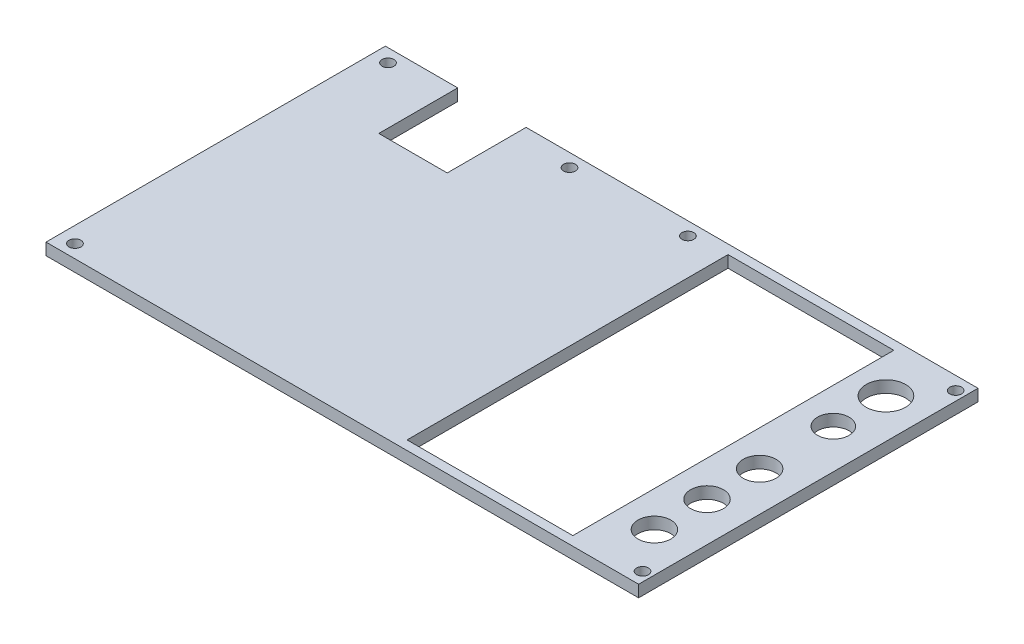
ISO-10303-21;
HEADER;
FILE_DESCRIPTION(('STEP AP214'),'2;1');
FILE_NAME('part.step','',(''),(''),'','','');
FILE_SCHEMA(('AUTOMOTIVE_DESIGN { 1 0 10303 214 1 1 1 1 }'));
ENDSEC;
DATA;
#1=APPLICATION_CONTEXT('core data for automotive mechanical design processes');
#2=APPLICATION_PROTOCOL_DEFINITION('international standard','automotive_design',2000,#1);
#3=PRODUCT_CONTEXT('',#1,'mechanical');
#4=PRODUCT('Part','Part','',(#3));
#5=PRODUCT_RELATED_PRODUCT_CATEGORY('part','',(#4));
#6=PRODUCT_DEFINITION_FORMATION('','',#4);
#7=PRODUCT_DEFINITION_CONTEXT('part definition',#1,'design');
#8=PRODUCT_DEFINITION('design','',#6,#7);
#9=PRODUCT_DEFINITION_SHAPE('','',#8);
#10=(LENGTH_UNIT() NAMED_UNIT(*) SI_UNIT(.MILLI.,.METRE.));
#11=(NAMED_UNIT(*) PLANE_ANGLE_UNIT() SI_UNIT($,.RADIAN.));
#12=(NAMED_UNIT(*) SI_UNIT($,.STERADIAN.) SOLID_ANGLE_UNIT());
#13=UNCERTAINTY_MEASURE_WITH_UNIT(LENGTH_MEASURE(1.E-05),#10,'distance_accuracy_value','');
#14=(GEOMETRIC_REPRESENTATION_CONTEXT(3) GLOBAL_UNCERTAINTY_ASSIGNED_CONTEXT((#13)) GLOBAL_UNIT_ASSIGNED_CONTEXT((#10,
#11,#12)) REPRESENTATION_CONTEXT('',''));
#15=CARTESIAN_POINT('',(0.,0.,0.));
#16=DIRECTION('',(0.,0.,1.));
#17=DIRECTION('',(1.,0.,0.));
#18=AXIS2_PLACEMENT_3D('',#15,#16,#17);
#19=CARTESIAN_POINT('',(0.,2.25,0.));
#20=DIRECTION('',(0.,-1.,0.));
#21=DIRECTION('',(0.,0.,-1.));
#22=AXIS2_PLACEMENT_3D('',#19,#20,#21);
#23=PLANE('',#22);
#24=CARTESIAN_POINT('',(-106.62,2.25,59.5));
#25=DIRECTION('',(0.,1.,0.));
#26=DIRECTION('',(0.,0.,1.));
#27=AXIS2_PLACEMENT_3D('',#24,#25,#26);
#28=CIRCLE('',#27,2.25);
#29=CARTESIAN_POINT('',(-106.62,2.25,61.75));
#30=VERTEX_POINT('',#29);
#31=EDGE_CURVE('E280',#30,#30,#28,.T.);
#32=ORIENTED_EDGE('',*,*,#31,.F.);
#33=EDGE_LOOP('',(#32));
#34=FACE_BOUND('',#33,.T.);
#35=CARTESIAN_POINT('',(-106.62,2.25,-59.5));
#36=DIRECTION('',(0.,1.,0.));
#37=DIRECTION('',(0.,0.,1.));
#38=AXIS2_PLACEMENT_3D('',#35,#36,#37);
#39=CIRCLE('',#38,2.25);
#40=CARTESIAN_POINT('',(-106.62,2.25,-57.25));
#41=VERTEX_POINT('',#40);
#42=EDGE_CURVE('E270',#41,#41,#39,.T.);
#43=ORIENTED_EDGE('',*,*,#42,.F.);
#44=EDGE_LOOP('',(#43));
#45=FACE_BOUND('',#44,.T.);
#46=CARTESIAN_POINT('',(-37.64,2.25,-59.5));
#47=DIRECTION('',(0.,1.,0.));
#48=DIRECTION('',(0.,0.,1.));
#49=AXIS2_PLACEMENT_3D('',#46,#47,#48);
#50=CIRCLE('',#49,2.25);
#51=CARTESIAN_POINT('',(-37.64,2.25,-57.25));
#52=VERTEX_POINT('',#51);
#53=EDGE_CURVE('E267',#52,#52,#50,.T.);
#54=ORIENTED_EDGE('',*,*,#53,.F.);
#55=EDGE_LOOP('',(#54));
#56=FACE_BOUND('',#55,.T.);
#57=CARTESIAN_POINT('',(7.35999999999997,2.25,-59.5));
#58=DIRECTION('',(0.,1.,0.));
#59=DIRECTION('',(0.,0.,1.));
#60=AXIS2_PLACEMENT_3D('',#57,#58,#59);
#61=CIRCLE('',#60,2.25);
#62=CARTESIAN_POINT('',(7.35999999999997,2.25,-57.25));
#63=VERTEX_POINT('',#62);
#64=EDGE_CURVE('E264',#63,#63,#61,.T.);
#65=ORIENTED_EDGE('',*,*,#64,.F.);
#66=EDGE_LOOP('',(#65));
#67=FACE_BOUND('',#66,.T.);
#68=CARTESIAN_POINT('',(109.12,2.25,-59.5));
#69=DIRECTION('',(0.,1.,0.));
#70=DIRECTION('',(0.,0.,1.));
#71=AXIS2_PLACEMENT_3D('',#68,#69,#70);
#72=CIRCLE('',#71,2.25);
#73=CARTESIAN_POINT('',(109.12,2.25,-57.25));
#74=VERTEX_POINT('',#73);
#75=EDGE_CURVE('E260',#74,#74,#72,.T.);
#76=ORIENTED_EDGE('',*,*,#75,.F.);
#77=EDGE_LOOP('',(#76));
#78=FACE_BOUND('',#77,.T.);
#79=CARTESIAN_POINT('',(97.62,2.25,43.5));
#80=DIRECTION('',(0.,1.,0.));
#81=DIRECTION('',(0.,0.,1.));
#82=AXIS2_PLACEMENT_3D('',#79,#80,#81);
#83=CIRCLE('',#82,6.25);
#84=CARTESIAN_POINT('',(97.62,2.25,49.75));
#85=VERTEX_POINT('',#84);
#86=EDGE_CURVE('E171',#85,#85,#83,.T.);
#87=ORIENTED_EDGE('',*,*,#86,.F.);
#88=EDGE_LOOP('',(#87));
#89=FACE_BOUND('',#88,.T.);
#90=CARTESIAN_POINT('',(97.62,2.25,23.5));
#91=DIRECTION('',(0.,1.,0.));
#92=DIRECTION('',(0.,0.,1.));
#93=AXIS2_PLACEMENT_3D('',#90,#91,#92);
#94=CIRCLE('',#93,6.25);
#95=CARTESIAN_POINT('',(97.62,2.25,29.75));
#96=VERTEX_POINT('',#95);
#97=EDGE_CURVE('E177',#96,#96,#94,.T.);
#98=ORIENTED_EDGE('',*,*,#97,.F.);
#99=EDGE_LOOP('',(#98));
#100=FACE_BOUND('',#99,.T.);
#101=CARTESIAN_POINT('',(97.62,2.25,3.5));
#102=DIRECTION('',(0.,1.,0.));
#103=DIRECTION('',(0.,0.,1.));
#104=AXIS2_PLACEMENT_3D('',#101,#102,#103);
#105=CIRCLE('',#104,6.25);
#106=CARTESIAN_POINT('',(97.62,2.25,9.75));
#107=VERTEX_POINT('',#106);
#108=EDGE_CURVE('E183',#107,#107,#105,.T.);
#109=ORIENTED_EDGE('',*,*,#108,.F.);
#110=EDGE_LOOP('',(#109));
#111=FACE_BOUND('',#110,.T.);
#112=CARTESIAN_POINT('',(97.62,2.25,-24.5));
#113=DIRECTION('',(0.,1.,0.));
#114=DIRECTION('',(0.,0.,1.));
#115=AXIS2_PLACEMENT_3D('',#112,#113,#114);
#116=CIRCLE('',#115,6.);
#117=CARTESIAN_POINT('',(97.62,2.25,-18.5));
#118=VERTEX_POINT('',#117);
#119=EDGE_CURVE('E189',#118,#118,#116,.T.);
#120=ORIENTED_EDGE('',*,*,#119,.F.);
#121=EDGE_LOOP('',(#120));
#122=FACE_BOUND('',#121,.T.);
#123=CARTESIAN_POINT('',(97.62,2.25,-44.5));
#124=DIRECTION('',(0.,1.,0.));
#125=DIRECTION('',(0.,0.,1.));
#126=AXIS2_PLACEMENT_3D('',#123,#124,#125);
#127=CIRCLE('',#126,7.5);
#128=CARTESIAN_POINT('',(97.62,2.25,-37.));
#129=VERTEX_POINT('',#128);
#130=EDGE_CURVE('E163',#129,#129,#127,.T.);
#131=ORIENTED_EDGE('',*,*,#130,.F.);
#132=EDGE_LOOP('',(#131));
#133=FACE_BOUND('',#132,.T.);
#134=DIRECTION('',(1.,0.,0.));
#135=VECTOR('',#134,1.);
#136=CARTESIAN_POINT('',(21.12,2.25,61.));
#137=LINE('',#136,#135);
#138=CARTESIAN_POINT('',(21.12,2.25,61.));
#139=VERTEX_POINT('',#138);
#140=CARTESIAN_POINT('',(84.12,2.25,61.));
#141=VERTEX_POINT('',#140);
#142=EDGE_CURVE('E212',#139,#141,#137,.T.);
#143=ORIENTED_EDGE('',*,*,#142,.F.);
#144=DIRECTION('',(0.,0.,1.));
#145=VECTOR('',#144,1.);
#146=CARTESIAN_POINT('',(21.12,2.25,61.));
#147=LINE('',#146,#145);
#148=CARTESIAN_POINT('',(21.1199999999999,2.25,-61.));
#149=VERTEX_POINT('',#148);
#150=EDGE_CURVE('E62',#149,#139,#147,.T.);
#151=ORIENTED_EDGE('',*,*,#150,.F.);
#152=DIRECTION('',(-1.,0.,0.));
#153=VECTOR('',#152,1.);
#154=CARTESIAN_POINT('',(21.1199999999999,2.25,-61.));
#155=LINE('',#154,#153);
#156=CARTESIAN_POINT('',(84.12,2.25,-61.));
#157=VERTEX_POINT('',#156);
#158=EDGE_CURVE('E201',#157,#149,#155,.T.);
#159=ORIENTED_EDGE('',*,*,#158,.F.);
#160=DIRECTION('',(0.,0.,-1.));
#161=VECTOR('',#160,1.);
#162=CARTESIAN_POINT('',(84.12,2.25,61.));
#163=LINE('',#162,#161);
#164=EDGE_CURVE('E215',#141,#157,#163,.T.);
#165=ORIENTED_EDGE('',*,*,#164,.F.);
#166=EDGE_LOOP('',(#143,#151,#159,#165));
#167=FACE_BOUND('',#166,.T.);
#168=DIRECTION('',(1.,0.,0.));
#169=VECTOR('',#168,1.);
#170=CARTESIAN_POINT('',(-85.13,2.25,-34.5));
#171=LINE('',#170,#169);
#172=CARTESIAN_POINT('',(-85.13,2.25,-34.5));
#173=VERTEX_POINT('',#172);
#174=CARTESIAN_POINT('',(-59.13,2.25,-34.5));
#175=VERTEX_POINT('',#174);
#176=EDGE_CURVE('E152',#173,#175,#171,.T.);
#177=ORIENTED_EDGE('',*,*,#176,.F.);
#178=DIRECTION('',(0.,0.,1.));
#179=VECTOR('',#178,1.);
#180=CARTESIAN_POINT('',(-85.13,2.25,-64.5));
#181=LINE('',#180,#179);
#182=CARTESIAN_POINT('',(-85.13,2.25,-64.5));
#183=VERTEX_POINT('',#182);
#184=EDGE_CURVE('E134',#183,#173,#181,.T.);
#185=ORIENTED_EDGE('',*,*,#184,.F.);
#186=DIRECTION('',(-1.,0.,0.));
#187=VECTOR('',#186,1.);
#188=CARTESIAN_POINT('',(-112.62,2.25,-64.5));
#189=LINE('',#188,#187);
#190=CARTESIAN_POINT('',(-112.62,2.25,-64.5));
#191=VERTEX_POINT('',#190);
#192=EDGE_CURVE('E236',#183,#191,#189,.T.);
#193=ORIENTED_EDGE('',*,*,#192,.T.);
#194=DIRECTION('',(0.,0.,1.));
#195=VECTOR('',#194,1.);
#196=CARTESIAN_POINT('',(-112.62,2.25,64.5));
#197=LINE('',#196,#195);
#198=CARTESIAN_POINT('',(-112.62,2.25,64.5));
#199=VERTEX_POINT('',#198);
#200=EDGE_CURVE('E228',#191,#199,#197,.T.);
#201=ORIENTED_EDGE('',*,*,#200,.T.);
#202=DIRECTION('',(1.,0.,0.));
#203=VECTOR('',#202,1.);
#204=CARTESIAN_POINT('',(-112.62,2.25,64.5));
#205=LINE('',#204,#203);
#206=CARTESIAN_POINT('',(112.62,2.25,64.5));
#207=VERTEX_POINT('',#206);
#208=EDGE_CURVE('E231',#199,#207,#205,.T.);
#209=ORIENTED_EDGE('',*,*,#208,.T.);
#210=DIRECTION('',(0.,0.,-1.));
#211=VECTOR('',#210,1.);
#212=CARTESIAN_POINT('',(112.62,2.25,64.5));
#213=LINE('',#212,#211);
#214=CARTESIAN_POINT('',(112.62,2.25,-64.5));
#215=VERTEX_POINT('',#214);
#216=EDGE_CURVE('E234',#207,#215,#213,.T.);
#217=ORIENTED_EDGE('',*,*,#216,.T.);
#218=CARTESIAN_POINT('',(-59.13,2.25,-64.5));
#219=VERTEX_POINT('',#218);
#220=EDGE_CURVE('E237',#215,#219,#189,.T.);
#221=ORIENTED_EDGE('',*,*,#220,.T.);
#222=DIRECTION('',(0.,0.,-1.));
#223=VECTOR('',#222,1.);
#224=CARTESIAN_POINT('',(-59.13,2.25,-64.5));
#225=LINE('',#224,#223);
#226=EDGE_CURVE('E150',#175,#219,#225,.T.);
#227=ORIENTED_EDGE('',*,*,#226,.F.);
#228=EDGE_LOOP('',(#177,#185,#193,#201,#209,#217,#221,#227));
#229=FACE_BOUND('',#228,.T.);
#230=CARTESIAN_POINT('',(109.12,2.25,59.5));
#231=DIRECTION('',(0.,1.,0.));
#232=DIRECTION('',(0.,0.,1.));
#233=AXIS2_PLACEMENT_3D('',#230,#231,#232);
#234=CIRCLE('',#233,2.25);
#235=CARTESIAN_POINT('',(109.12,2.25,61.75));
#236=VERTEX_POINT('',#235);
#237=EDGE_CURVE('E259',#236,#236,#234,.T.);
#238=ORIENTED_EDGE('',*,*,#237,.F.);
#239=EDGE_LOOP('',(#238));
#240=FACE_BOUND('',#239,.T.);
#241=ADVANCED_FACE('F37',(#34,#45,#56,#67,#78,#89,#100,#111,#122,#133,#167,#229,#240),#23,.F.);
#242=CARTESIAN_POINT('',(-112.62,2.25,-64.5));
#243=DIRECTION('',(0.,0.,1.));
#244=DIRECTION('',(1.,0.,0.));
#245=AXIS2_PLACEMENT_3D('',#242,#243,#244);
#246=PLANE('',#245);
#247=ORIENTED_EDGE('',*,*,#192,.F.);
#248=DIRECTION('',(0.,1.,0.));
#249=VECTOR('',#248,1.);
#250=CARTESIAN_POINT('',(-85.13,-2.25,-64.5));
#251=LINE('',#250,#249);
#252=CARTESIAN_POINT('',(-85.13,-2.25,-64.5));
#253=VERTEX_POINT('',#252);
#254=EDGE_CURVE('E161',#253,#183,#251,.T.);
#255=ORIENTED_EDGE('',*,*,#254,.F.);
#256=DIRECTION('',(-1.,0.,0.));
#257=VECTOR('',#256,1.);
#258=CARTESIAN_POINT('',(-112.62,-2.25,-64.5));
#259=LINE('',#258,#257);
#260=CARTESIAN_POINT('',(-112.62,-2.25,-64.5));
#261=VERTEX_POINT('',#260);
#262=EDGE_CURVE('E149',#253,#261,#259,.T.);
#263=ORIENTED_EDGE('',*,*,#262,.T.);
#264=DIRECTION('',(0.,-1.,0.));
#265=VECTOR('',#264,1.);
#266=CARTESIAN_POINT('',(-112.62,2.25,-64.5));
#267=LINE('',#266,#265);
#268=EDGE_CURVE('E240',#191,#261,#267,.T.);
#269=ORIENTED_EDGE('',*,*,#268,.F.);
#270=EDGE_LOOP('',(#247,#255,#263,#269));
#271=FACE_BOUND('',#270,.T.);
#272=ADVANCED_FACE('F308',(#271),#246,.F.);
#273=CARTESIAN_POINT('',(-112.62,2.25,64.5));
#274=DIRECTION('',(1.,0.,0.));
#275=DIRECTION('',(0.,0.,-1.));
#276=AXIS2_PLACEMENT_3D('',#273,#274,#275);
#277=PLANE('',#276);
#278=DIRECTION('',(0.,0.,1.));
#279=VECTOR('',#278,1.);
#280=CARTESIAN_POINT('',(-112.62,-2.25,64.5));
#281=LINE('',#280,#279);
#282=CARTESIAN_POINT('',(-112.62,-2.25,64.5));
#283=VERTEX_POINT('',#282);
#284=EDGE_CURVE('E222',#261,#283,#281,.T.);
#285=ORIENTED_EDGE('',*,*,#284,.T.);
#286=DIRECTION('',(0.,-1.,0.));
#287=VECTOR('',#286,1.);
#288=CARTESIAN_POINT('',(-112.62,2.25,64.5));
#289=LINE('',#288,#287);
#290=EDGE_CURVE('E11',#199,#283,#289,.T.);
#291=ORIENTED_EDGE('',*,*,#290,.F.);
#292=ORIENTED_EDGE('',*,*,#200,.F.);
#293=ORIENTED_EDGE('',*,*,#268,.T.);
#294=EDGE_LOOP('',(#285,#291,#292,#293));
#295=FACE_BOUND('',#294,.T.);
#296=ADVANCED_FACE('F39',(#295),#277,.F.);
#297=CARTESIAN_POINT('',(-112.62,2.25,64.5));
#298=DIRECTION('',(0.,0.,-1.));
#299=DIRECTION('',(-1.,0.,0.));
#300=AXIS2_PLACEMENT_3D('',#297,#298,#299);
#301=PLANE('',#300);
#302=DIRECTION('',(1.,0.,0.));
#303=VECTOR('',#302,1.);
#304=CARTESIAN_POINT('',(-112.62,-2.25,64.5));
#305=LINE('',#304,#303);
#306=CARTESIAN_POINT('',(112.62,-2.25,64.5));
#307=VERTEX_POINT('',#306);
#308=EDGE_CURVE('E243',#283,#307,#305,.T.);
#309=ORIENTED_EDGE('',*,*,#308,.T.);
#310=DIRECTION('',(0.,-1.,0.));
#311=VECTOR('',#310,1.);
#312=CARTESIAN_POINT('',(112.62,2.25,64.5));
#313=LINE('',#312,#311);
#314=EDGE_CURVE('E46',#207,#307,#313,.T.);
#315=ORIENTED_EDGE('',*,*,#314,.F.);
#316=ORIENTED_EDGE('',*,*,#208,.F.);
#317=ORIENTED_EDGE('',*,*,#290,.T.);
#318=EDGE_LOOP('',(#309,#315,#316,#317));
#319=FACE_BOUND('',#318,.T.);
#320=ADVANCED_FACE('F463',(#319),#301,.F.);
#321=CARTESIAN_POINT('',(112.62,2.25,64.5));
#322=DIRECTION('',(-1.,0.,0.));
#323=DIRECTION('',(0.,0.,1.));
#324=AXIS2_PLACEMENT_3D('',#321,#322,#323);
#325=PLANE('',#324);
#326=DIRECTION('',(0.,0.,-1.));
#327=VECTOR('',#326,1.);
#328=CARTESIAN_POINT('',(112.62,-2.25,64.5));
#329=LINE('',#328,#327);
#330=CARTESIAN_POINT('',(112.62,-2.25,-64.5));
#331=VERTEX_POINT('',#330);
#332=EDGE_CURVE('E245',#307,#331,#329,.T.);
#333=ORIENTED_EDGE('',*,*,#332,.T.);
#334=DIRECTION('',(0.,-1.,0.));
#335=VECTOR('',#334,1.);
#336=CARTESIAN_POINT('',(112.62,2.25,-64.5));
#337=LINE('',#336,#335);
#338=EDGE_CURVE('E251',#215,#331,#337,.T.);
#339=ORIENTED_EDGE('',*,*,#338,.F.);
#340=ORIENTED_EDGE('',*,*,#216,.F.);
#341=ORIENTED_EDGE('',*,*,#314,.T.);
#342=EDGE_LOOP('',(#333,#339,#340,#341));
#343=FACE_BOUND('',#342,.T.);
#344=ADVANCED_FACE('F305',(#343),#325,.F.);
#345=CARTESIAN_POINT('',(-59.13,-2.25,-64.5));
#346=VERTEX_POINT('',#345);
#347=EDGE_CURVE('E232',#331,#346,#259,.T.);
#348=ORIENTED_EDGE('',*,*,#347,.T.);
#349=DIRECTION('',(0.,1.,0.));
#350=VECTOR('',#349,1.);
#351=CARTESIAN_POINT('',(-59.13,-2.25,-64.5));
#352=LINE('',#351,#350);
#353=EDGE_CURVE('E164',#346,#219,#352,.T.);
#354=ORIENTED_EDGE('',*,*,#353,.T.);
#355=ORIENTED_EDGE('',*,*,#220,.F.);
#356=ORIENTED_EDGE('',*,*,#338,.T.);
#357=EDGE_LOOP('',(#348,#354,#355,#356));
#358=FACE_BOUND('',#357,.T.);
#359=ADVANCED_FACE('F296',(#358),#246,.F.);
#360=CARTESIAN_POINT('',(0.,-2.25,0.));
#361=DIRECTION('',(0.,-1.,0.));
#362=DIRECTION('',(0.,0.,-1.));
#363=AXIS2_PLACEMENT_3D('',#360,#361,#362);
#364=PLANE('',#363);
#365=CARTESIAN_POINT('',(-106.62,-2.25,59.5));
#366=DIRECTION('',(0.,-1.,0.));
#367=DIRECTION('',(0.,0.,-1.));
#368=AXIS2_PLACEMENT_3D('',#365,#366,#367);
#369=CIRCLE('',#368,2.25);
#370=CARTESIAN_POINT('',(-106.62,-2.25,57.25));
#371=VERTEX_POINT('',#370);
#372=EDGE_CURVE('E41',#371,#371,#369,.T.);
#373=ORIENTED_EDGE('',*,*,#372,.F.);
#374=EDGE_LOOP('',(#373));
#375=FACE_BOUND('',#374,.T.);
#376=CARTESIAN_POINT('',(-106.62,-2.25,-59.5));
#377=DIRECTION('',(0.,-1.,0.));
#378=DIRECTION('',(0.,0.,-1.));
#379=AXIS2_PLACEMENT_3D('',#376,#377,#378);
#380=CIRCLE('',#379,2.25);
#381=CARTESIAN_POINT('',(-106.62,-2.25,-61.75));
#382=VERTEX_POINT('',#381);
#383=EDGE_CURVE('E268',#382,#382,#380,.T.);
#384=ORIENTED_EDGE('',*,*,#383,.F.);
#385=EDGE_LOOP('',(#384));
#386=FACE_BOUND('',#385,.T.);
#387=CARTESIAN_POINT('',(-37.64,-2.25,-59.5));
#388=DIRECTION('',(0.,-1.,0.));
#389=DIRECTION('',(0.,0.,-1.));
#390=AXIS2_PLACEMENT_3D('',#387,#388,#389);
#391=CIRCLE('',#390,2.25);
#392=CARTESIAN_POINT('',(-37.64,-2.25,-61.75));
#393=VERTEX_POINT('',#392);
#394=EDGE_CURVE('E265',#393,#393,#391,.T.);
#395=ORIENTED_EDGE('',*,*,#394,.F.);
#396=EDGE_LOOP('',(#395));
#397=FACE_BOUND('',#396,.T.);
#398=CARTESIAN_POINT('',(7.35999999999997,-2.25,-59.5));
#399=DIRECTION('',(0.,-1.,0.));
#400=DIRECTION('',(0.,0.,-1.));
#401=AXIS2_PLACEMENT_3D('',#398,#399,#400);
#402=CIRCLE('',#401,2.25);
#403=CARTESIAN_POINT('',(7.35999999999997,-2.25,-61.75));
#404=VERTEX_POINT('',#403);
#405=EDGE_CURVE('E261',#404,#404,#402,.T.);
#406=ORIENTED_EDGE('',*,*,#405,.F.);
#407=EDGE_LOOP('',(#406));
#408=FACE_BOUND('',#407,.T.);
#409=CARTESIAN_POINT('',(109.12,-2.25,-59.5));
#410=DIRECTION('',(0.,-1.,0.));
#411=DIRECTION('',(0.,0.,-1.));
#412=AXIS2_PLACEMENT_3D('',#409,#410,#411);
#413=CIRCLE('',#412,2.25);
#414=CARTESIAN_POINT('',(109.12,-2.25,-61.75));
#415=VERTEX_POINT('',#414);
#416=EDGE_CURVE('E256',#415,#415,#413,.T.);
#417=ORIENTED_EDGE('',*,*,#416,.F.);
#418=EDGE_LOOP('',(#417));
#419=FACE_BOUND('',#418,.T.);
#420=CARTESIAN_POINT('',(109.12,-2.25,59.5));
#421=DIRECTION('',(0.,-1.,0.));
#422=DIRECTION('',(0.,0.,-1.));
#423=AXIS2_PLACEMENT_3D('',#420,#421,#422);
#424=CIRCLE('',#423,2.25);
#425=CARTESIAN_POINT('',(109.12,-2.25,57.25));
#426=VERTEX_POINT('',#425);
#427=EDGE_CURVE('E155',#426,#426,#424,.T.);
#428=ORIENTED_EDGE('',*,*,#427,.F.);
#429=EDGE_LOOP('',(#428));
#430=FACE_BOUND('',#429,.T.);
#431=DIRECTION('',(0.,0.,1.));
#432=VECTOR('',#431,1.);
#433=CARTESIAN_POINT('',(-85.13,-2.25,-64.5));
#434=LINE('',#433,#432);
#435=CARTESIAN_POINT('',(-85.13,-2.25,-34.5));
#436=VERTEX_POINT('',#435);
#437=EDGE_CURVE('E131',#253,#436,#434,.T.);
#438=ORIENTED_EDGE('',*,*,#437,.T.);
#439=DIRECTION('',(1.,0.,0.));
#440=VECTOR('',#439,1.);
#441=CARTESIAN_POINT('',(-85.13,-2.25,-34.5));
#442=LINE('',#441,#440);
#443=CARTESIAN_POINT('',(-59.13,-2.25,-34.5));
#444=VERTEX_POINT('',#443);
#445=EDGE_CURVE('E141',#436,#444,#442,.T.);
#446=ORIENTED_EDGE('',*,*,#445,.T.);
#447=DIRECTION('',(0.,0.,-1.));
#448=VECTOR('',#447,1.);
#449=CARTESIAN_POINT('',(-59.13,-2.25,-64.5));
#450=LINE('',#449,#448);
#451=EDGE_CURVE('E54',#444,#346,#450,.T.);
#452=ORIENTED_EDGE('',*,*,#451,.T.);
#453=ORIENTED_EDGE('',*,*,#347,.F.);
#454=ORIENTED_EDGE('',*,*,#332,.F.);
#455=ORIENTED_EDGE('',*,*,#308,.F.);
#456=ORIENTED_EDGE('',*,*,#284,.F.);
#457=ORIENTED_EDGE('',*,*,#262,.F.);
#458=EDGE_LOOP('',(#438,#446,#452,#453,#454,#455,#456,#457));
#459=FACE_BOUND('',#458,.T.);
#460=CARTESIAN_POINT('',(97.62,-2.25,43.5));
#461=DIRECTION('',(0.,1.,0.));
#462=DIRECTION('',(0.,0.,1.));
#463=AXIS2_PLACEMENT_3D('',#460,#461,#462);
#464=CIRCLE('',#463,6.25);
#465=CARTESIAN_POINT('',(97.62,-2.25,49.75));
#466=VERTEX_POINT('',#465);
#467=EDGE_CURVE('E168',#466,#466,#464,.T.);
#468=ORIENTED_EDGE('',*,*,#467,.T.);
#469=EDGE_LOOP('',(#468));
#470=FACE_BOUND('',#469,.T.);
#471=CARTESIAN_POINT('',(97.62,-2.25,23.5));
#472=DIRECTION('',(0.,1.,0.));
#473=DIRECTION('',(0.,0.,1.));
#474=AXIS2_PLACEMENT_3D('',#471,#472,#473);
#475=CIRCLE('',#474,6.25);
#476=CARTESIAN_POINT('',(97.62,-2.25,29.75));
#477=VERTEX_POINT('',#476);
#478=EDGE_CURVE('E174',#477,#477,#475,.T.);
#479=ORIENTED_EDGE('',*,*,#478,.T.);
#480=EDGE_LOOP('',(#479));
#481=FACE_BOUND('',#480,.T.);
#482=CARTESIAN_POINT('',(97.62,-2.25,3.5));
#483=DIRECTION('',(0.,1.,0.));
#484=DIRECTION('',(0.,0.,1.));
#485=AXIS2_PLACEMENT_3D('',#482,#483,#484);
#486=CIRCLE('',#485,6.25);
#487=CARTESIAN_POINT('',(97.62,-2.25,9.75));
#488=VERTEX_POINT('',#487);
#489=EDGE_CURVE('E180',#488,#488,#486,.T.);
#490=ORIENTED_EDGE('',*,*,#489,.T.);
#491=EDGE_LOOP('',(#490));
#492=FACE_BOUND('',#491,.T.);
#493=CARTESIAN_POINT('',(97.62,-2.25,-24.5));
#494=DIRECTION('',(0.,1.,0.));
#495=DIRECTION('',(0.,0.,1.));
#496=AXIS2_PLACEMENT_3D('',#493,#494,#495);
#497=CIRCLE('',#496,6.);
#498=CARTESIAN_POINT('',(97.62,-2.25,-18.5));
#499=VERTEX_POINT('',#498);
#500=EDGE_CURVE('E186',#499,#499,#497,.T.);
#501=ORIENTED_EDGE('',*,*,#500,.T.);
#502=EDGE_LOOP('',(#501));
#503=FACE_BOUND('',#502,.T.);
#504=CARTESIAN_POINT('',(97.62,-2.25,-44.5));
#505=DIRECTION('',(0.,1.,0.));
#506=DIRECTION('',(0.,0.,1.));
#507=AXIS2_PLACEMENT_3D('',#504,#505,#506);
#508=CIRCLE('',#507,7.5);
#509=CARTESIAN_POINT('',(97.62,-2.25,-37.));
#510=VERTEX_POINT('',#509);
#511=EDGE_CURVE('E192',#510,#510,#508,.T.);
#512=ORIENTED_EDGE('',*,*,#511,.T.);
#513=EDGE_LOOP('',(#512));
#514=FACE_BOUND('',#513,.T.);
#515=DIRECTION('',(0.,0.,1.));
#516=VECTOR('',#515,1.);
#517=CARTESIAN_POINT('',(21.12,-2.25,61.));
#518=LINE('',#517,#516);
#519=CARTESIAN_POINT('',(21.1199999999999,-2.25,-61.));
#520=VERTEX_POINT('',#519);
#521=CARTESIAN_POINT('',(21.12,-2.25,61.));
#522=VERTEX_POINT('',#521);
#523=EDGE_CURVE('E197',#520,#522,#518,.T.);
#524=ORIENTED_EDGE('',*,*,#523,.T.);
#525=DIRECTION('',(1.,0.,0.));
#526=VECTOR('',#525,1.);
#527=CARTESIAN_POINT('',(21.12,-2.25,61.));
#528=LINE('',#527,#526);
#529=CARTESIAN_POINT('',(84.12,-2.25,61.));
#530=VERTEX_POINT('',#529);
#531=EDGE_CURVE('E200',#522,#530,#528,.T.);
#532=ORIENTED_EDGE('',*,*,#531,.T.);
#533=DIRECTION('',(0.,0.,-1.));
#534=VECTOR('',#533,1.);
#535=CARTESIAN_POINT('',(84.12,-2.25,61.));
#536=LINE('',#535,#534);
#537=CARTESIAN_POINT('',(84.12,-2.25,-61.));
#538=VERTEX_POINT('',#537);
#539=EDGE_CURVE('E204',#530,#538,#536,.T.);
#540=ORIENTED_EDGE('',*,*,#539,.T.);
#541=DIRECTION('',(-1.,0.,0.));
#542=VECTOR('',#541,1.);
#543=CARTESIAN_POINT('',(21.1199999999999,-2.25,-61.));
#544=LINE('',#543,#542);
#545=EDGE_CURVE('E207',#538,#520,#544,.T.);
#546=ORIENTED_EDGE('',*,*,#545,.T.);
#547=EDGE_LOOP('',(#524,#532,#540,#546));
#548=FACE_BOUND('',#547,.T.);
#549=ADVANCED_FACE('F146',(#375,#386,#397,#408,#419,#430,#459,#470,#481,#492,#503,#514,#548),
#364,.T.);
#550=CARTESIAN_POINT('',(21.12,-2.25,61.));
#551=DIRECTION('',(-1.,0.,0.));
#552=DIRECTION('',(0.,0.,1.));
#553=AXIS2_PLACEMENT_3D('',#550,#551,#552);
#554=PLANE('',#553);
#555=ORIENTED_EDGE('',*,*,#150,.T.);
#556=DIRECTION('',(0.,1.,0.));
#557=VECTOR('',#556,1.);
#558=CARTESIAN_POINT('',(21.12,-2.25,61.));
#559=LINE('',#558,#557);
#560=EDGE_CURVE('E210',#522,#139,#559,.T.);
#561=ORIENTED_EDGE('',*,*,#560,.F.);
#562=ORIENTED_EDGE('',*,*,#523,.F.);
#563=DIRECTION('',(0.,1.,0.));
#564=VECTOR('',#563,1.);
#565=CARTESIAN_POINT('',(21.1199999999999,-2.25,-61.));
#566=LINE('',#565,#564);
#567=EDGE_CURVE('E220',#520,#149,#566,.T.);
#568=ORIENTED_EDGE('',*,*,#567,.T.);
#569=EDGE_LOOP('',(#555,#561,#562,#568));
#570=FACE_BOUND('',#569,.T.);
#571=ADVANCED_FACE('F295',(#570),#554,.F.);
#572=CARTESIAN_POINT('',(21.1199999999999,-2.25,-61.));
#573=DIRECTION('',(0.,0.,-1.));
#574=DIRECTION('',(-1.,0.,0.));
#575=AXIS2_PLACEMENT_3D('',#572,#573,#574);
#576=PLANE('',#575);
#577=ORIENTED_EDGE('',*,*,#158,.T.);
#578=ORIENTED_EDGE('',*,*,#567,.F.);
#579=ORIENTED_EDGE('',*,*,#545,.F.);
#580=DIRECTION('',(0.,1.,0.));
#581=VECTOR('',#580,1.);
#582=CARTESIAN_POINT('',(84.12,-2.25,-61.));
#583=LINE('',#582,#581);
#584=EDGE_CURVE('E223',#538,#157,#583,.T.);
#585=ORIENTED_EDGE('',*,*,#584,.T.);
#586=EDGE_LOOP('',(#577,#578,#579,#585));
#587=FACE_BOUND('',#586,.T.);
#588=ADVANCED_FACE('F303',(#587),#576,.F.);
#589=CARTESIAN_POINT('',(84.12,-2.25,61.));
#590=DIRECTION('',(1.,0.,0.));
#591=DIRECTION('',(0.,0.,-1.));
#592=AXIS2_PLACEMENT_3D('',#589,#590,#591);
#593=PLANE('',#592);
#594=ORIENTED_EDGE('',*,*,#164,.T.);
#595=ORIENTED_EDGE('',*,*,#584,.F.);
#596=ORIENTED_EDGE('',*,*,#539,.F.);
#597=DIRECTION('',(0.,1.,0.));
#598=VECTOR('',#597,1.);
#599=CARTESIAN_POINT('',(84.12,-2.25,61.));
#600=LINE('',#599,#598);
#601=EDGE_CURVE('E225',#530,#141,#600,.T.);
#602=ORIENTED_EDGE('',*,*,#601,.T.);
#603=EDGE_LOOP('',(#594,#595,#596,#602));
#604=FACE_BOUND('',#603,.T.);
#605=ADVANCED_FACE('F325',(#604),#593,.F.);
#606=CARTESIAN_POINT('',(21.12,-2.25,61.));
#607=DIRECTION('',(0.,0.,1.));
#608=DIRECTION('',(1.,0.,0.));
#609=AXIS2_PLACEMENT_3D('',#606,#607,#608);
#610=PLANE('',#609);
#611=ORIENTED_EDGE('',*,*,#142,.T.);
#612=ORIENTED_EDGE('',*,*,#601,.F.);
#613=ORIENTED_EDGE('',*,*,#531,.F.);
#614=ORIENTED_EDGE('',*,*,#560,.T.);
#615=EDGE_LOOP('',(#611,#612,#613,#614));
#616=FACE_BOUND('',#615,.T.);
#617=ADVANCED_FACE('F321',(#616),#610,.F.);
#618=CARTESIAN_POINT('',(97.62,-2.25,-44.5));
#619=DIRECTION('',(0.,1.,0.));
#620=DIRECTION('',(0.,0.,1.));
#621=AXIS2_PLACEMENT_3D('',#618,#619,#620);
#622=CYLINDRICAL_SURFACE('',#621,7.5);
#623=ORIENTED_EDGE('',*,*,#511,.F.);
#624=EDGE_LOOP('',(#623));
#625=FACE_BOUND('',#624,.T.);
#626=ORIENTED_EDGE('',*,*,#130,.T.);
#627=EDGE_LOOP('',(#626));
#628=FACE_BOUND('',#627,.T.);
#629=ADVANCED_FACE('F324',(#625,#628),#622,.F.);
#630=CARTESIAN_POINT('',(97.62,-2.25,-24.5));
#631=DIRECTION('',(0.,1.,0.));
#632=DIRECTION('',(0.,0.,1.));
#633=AXIS2_PLACEMENT_3D('',#630,#631,#632);
#634=CYLINDRICAL_SURFACE('',#633,6.);
#635=ORIENTED_EDGE('',*,*,#500,.F.);
#636=EDGE_LOOP('',(#635));
#637=FACE_BOUND('',#636,.T.);
#638=ORIENTED_EDGE('',*,*,#119,.T.);
#639=EDGE_LOOP('',(#638));
#640=FACE_BOUND('',#639,.T.);
#641=ADVANCED_FACE('F335',(#637,#640),#634,.F.);
#642=CARTESIAN_POINT('',(97.62,-2.25,3.5));
#643=DIRECTION('',(0.,1.,0.));
#644=DIRECTION('',(0.,0.,1.));
#645=AXIS2_PLACEMENT_3D('',#642,#643,#644);
#646=CYLINDRICAL_SURFACE('',#645,6.25);
#647=ORIENTED_EDGE('',*,*,#489,.F.);
#648=EDGE_LOOP('',(#647));
#649=FACE_BOUND('',#648,.T.);
#650=ORIENTED_EDGE('',*,*,#108,.T.);
#651=EDGE_LOOP('',(#650));
#652=FACE_BOUND('',#651,.T.);
#653=ADVANCED_FACE('F339',(#649,#652),#646,.F.);
#654=CARTESIAN_POINT('',(97.62,-2.25,23.5));
#655=DIRECTION('',(0.,1.,0.));
#656=DIRECTION('',(0.,0.,1.));
#657=AXIS2_PLACEMENT_3D('',#654,#655,#656);
#658=CYLINDRICAL_SURFACE('',#657,6.25);
#659=ORIENTED_EDGE('',*,*,#478,.F.);
#660=EDGE_LOOP('',(#659));
#661=FACE_BOUND('',#660,.T.);
#662=ORIENTED_EDGE('',*,*,#97,.T.);
#663=EDGE_LOOP('',(#662));
#664=FACE_BOUND('',#663,.T.);
#665=ADVANCED_FACE('F343',(#661,#664),#658,.F.);
#666=CARTESIAN_POINT('',(97.62,-2.25,43.5));
#667=DIRECTION('',(0.,1.,0.));
#668=DIRECTION('',(0.,0.,1.));
#669=AXIS2_PLACEMENT_3D('',#666,#667,#668);
#670=CYLINDRICAL_SURFACE('',#669,6.25);
#671=ORIENTED_EDGE('',*,*,#467,.F.);
#672=EDGE_LOOP('',(#671));
#673=FACE_BOUND('',#672,.T.);
#674=ORIENTED_EDGE('',*,*,#86,.T.);
#675=EDGE_LOOP('',(#674));
#676=FACE_BOUND('',#675,.T.);
#677=ADVANCED_FACE('F347',(#673,#676),#670,.F.);
#678=CARTESIAN_POINT('',(-85.13,-2.25,-64.5));
#679=DIRECTION('',(-1.,0.,0.));
#680=DIRECTION('',(0.,0.,1.));
#681=AXIS2_PLACEMENT_3D('',#678,#679,#680);
#682=PLANE('',#681);
#683=ORIENTED_EDGE('',*,*,#184,.T.);
#684=DIRECTION('',(0.,1.,0.));
#685=VECTOR('',#684,1.);
#686=CARTESIAN_POINT('',(-85.13,-2.25,-34.5));
#687=LINE('',#686,#685);
#688=EDGE_CURVE('E127',#436,#173,#687,.T.);
#689=ORIENTED_EDGE('',*,*,#688,.F.);
#690=ORIENTED_EDGE('',*,*,#437,.F.);
#691=ORIENTED_EDGE('',*,*,#254,.T.);
#692=EDGE_LOOP('',(#683,#689,#690,#691));
#693=FACE_BOUND('',#692,.T.);
#694=ADVANCED_FACE('F129',(#693),#682,.F.);
#695=CARTESIAN_POINT('',(-59.13,-2.25,-64.5));
#696=DIRECTION('',(1.,0.,0.));
#697=DIRECTION('',(0.,0.,-1.));
#698=AXIS2_PLACEMENT_3D('',#695,#696,#697);
#699=PLANE('',#698);
#700=ORIENTED_EDGE('',*,*,#226,.T.);
#701=ORIENTED_EDGE('',*,*,#353,.F.);
#702=ORIENTED_EDGE('',*,*,#451,.F.);
#703=DIRECTION('',(0.,1.,0.));
#704=VECTOR('',#703,1.);
#705=CARTESIAN_POINT('',(-59.13,-2.25,-34.5));
#706=LINE('',#705,#704);
#707=EDGE_CURVE('E138',#444,#175,#706,.T.);
#708=ORIENTED_EDGE('',*,*,#707,.T.);
#709=EDGE_LOOP('',(#700,#701,#702,#708));
#710=FACE_BOUND('',#709,.T.);
#711=ADVANCED_FACE('F354',(#710),#699,.F.);
#712=CARTESIAN_POINT('',(-85.13,-2.25,-34.5));
#713=DIRECTION('',(0.,0.,1.));
#714=DIRECTION('',(1.,0.,0.));
#715=AXIS2_PLACEMENT_3D('',#712,#713,#714);
#716=PLANE('',#715);
#717=ORIENTED_EDGE('',*,*,#176,.T.);
#718=ORIENTED_EDGE('',*,*,#707,.F.);
#719=ORIENTED_EDGE('',*,*,#445,.F.);
#720=ORIENTED_EDGE('',*,*,#688,.T.);
#721=EDGE_LOOP('',(#717,#718,#719,#720));
#722=FACE_BOUND('',#721,.T.);
#723=ADVANCED_FACE('F142',(#722),#716,.F.);
#724=CARTESIAN_POINT('',(109.12,2.25,59.5));
#725=DIRECTION('',(0.,1.,0.));
#726=DIRECTION('',(0.,0.,1.));
#727=AXIS2_PLACEMENT_3D('',#724,#725,#726);
#728=CYLINDRICAL_SURFACE('',#727,2.25);
#729=ORIENTED_EDGE('',*,*,#427,.T.);
#730=EDGE_LOOP('',(#729));
#731=FACE_BOUND('',#730,.T.);
#732=ORIENTED_EDGE('',*,*,#237,.T.);
#733=EDGE_LOOP('',(#732));
#734=FACE_BOUND('',#733,.T.);
#735=ADVANCED_FACE('F292',(#731,#734),#728,.F.);
#736=CARTESIAN_POINT('',(109.12,2.25,-59.5));
#737=DIRECTION('',(0.,1.,0.));
#738=DIRECTION('',(0.,0.,1.));
#739=AXIS2_PLACEMENT_3D('',#736,#737,#738);
#740=CYLINDRICAL_SURFACE('',#739,2.25);
#741=ORIENTED_EDGE('',*,*,#416,.T.);
#742=EDGE_LOOP('',(#741));
#743=FACE_BOUND('',#742,.T.);
#744=ORIENTED_EDGE('',*,*,#75,.T.);
#745=EDGE_LOOP('',(#744));
#746=FACE_BOUND('',#745,.T.);
#747=ADVANCED_FACE('F361',(#743,#746),#740,.F.);
#748=CARTESIAN_POINT('',(7.35999999999997,2.25,-59.5));
#749=DIRECTION('',(0.,1.,0.));
#750=DIRECTION('',(0.,0.,1.));
#751=AXIS2_PLACEMENT_3D('',#748,#749,#750);
#752=CYLINDRICAL_SURFACE('',#751,2.25);
#753=ORIENTED_EDGE('',*,*,#405,.T.);
#754=EDGE_LOOP('',(#753));
#755=FACE_BOUND('',#754,.T.);
#756=ORIENTED_EDGE('',*,*,#64,.T.);
#757=EDGE_LOOP('',(#756));
#758=FACE_BOUND('',#757,.T.);
#759=ADVANCED_FACE('F364',(#755,#758),#752,.F.);
#760=CARTESIAN_POINT('',(-37.64,2.25,-59.5));
#761=DIRECTION('',(0.,1.,0.));
#762=DIRECTION('',(0.,0.,1.));
#763=AXIS2_PLACEMENT_3D('',#760,#761,#762);
#764=CYLINDRICAL_SURFACE('',#763,2.25);
#765=ORIENTED_EDGE('',*,*,#394,.T.);
#766=EDGE_LOOP('',(#765));
#767=FACE_BOUND('',#766,.T.);
#768=ORIENTED_EDGE('',*,*,#53,.T.);
#769=EDGE_LOOP('',(#768));
#770=FACE_BOUND('',#769,.T.);
#771=ADVANCED_FACE('F368',(#767,#770),#764,.F.);
#772=CARTESIAN_POINT('',(-106.62,2.25,-59.5));
#773=DIRECTION('',(0.,1.,0.));
#774=DIRECTION('',(0.,0.,1.));
#775=AXIS2_PLACEMENT_3D('',#772,#773,#774);
#776=CYLINDRICAL_SURFACE('',#775,2.25);
#777=ORIENTED_EDGE('',*,*,#383,.T.);
#778=EDGE_LOOP('',(#777));
#779=FACE_BOUND('',#778,.T.);
#780=ORIENTED_EDGE('',*,*,#42,.T.);
#781=EDGE_LOOP('',(#780));
#782=FACE_BOUND('',#781,.T.);
#783=ADVANCED_FACE('F372',(#779,#782),#776,.F.);
#784=CARTESIAN_POINT('',(-106.62,2.25,59.5));
#785=DIRECTION('',(0.,1.,0.));
#786=DIRECTION('',(0.,0.,1.));
#787=AXIS2_PLACEMENT_3D('',#784,#785,#786);
#788=CYLINDRICAL_SURFACE('',#787,2.25);
#789=ORIENTED_EDGE('',*,*,#372,.T.);
#790=EDGE_LOOP('',(#789));
#791=FACE_BOUND('',#790,.T.);
#792=ORIENTED_EDGE('',*,*,#31,.T.);
#793=EDGE_LOOP('',(#792));
#794=FACE_BOUND('',#793,.T.);
#795=ADVANCED_FACE('F376',(#791,#794),#788,.F.);
#796=CLOSED_SHELL('',(#241,#272,#296,#320,#344,#359,#549,#571,#588,#605,#617,#629,#641,#653,
#665,#677,#694,#711,#723,#735,#747,#759,#771,#783,#795));
#797=MANIFOLD_SOLID_BREP('B2',#796);
#798=ADVANCED_BREP_SHAPE_REPRESENTATION('',(#18,#797),#14);
#799=SHAPE_DEFINITION_REPRESENTATION(#9,#798);
ENDSEC;
END-ISO-10303-21;
